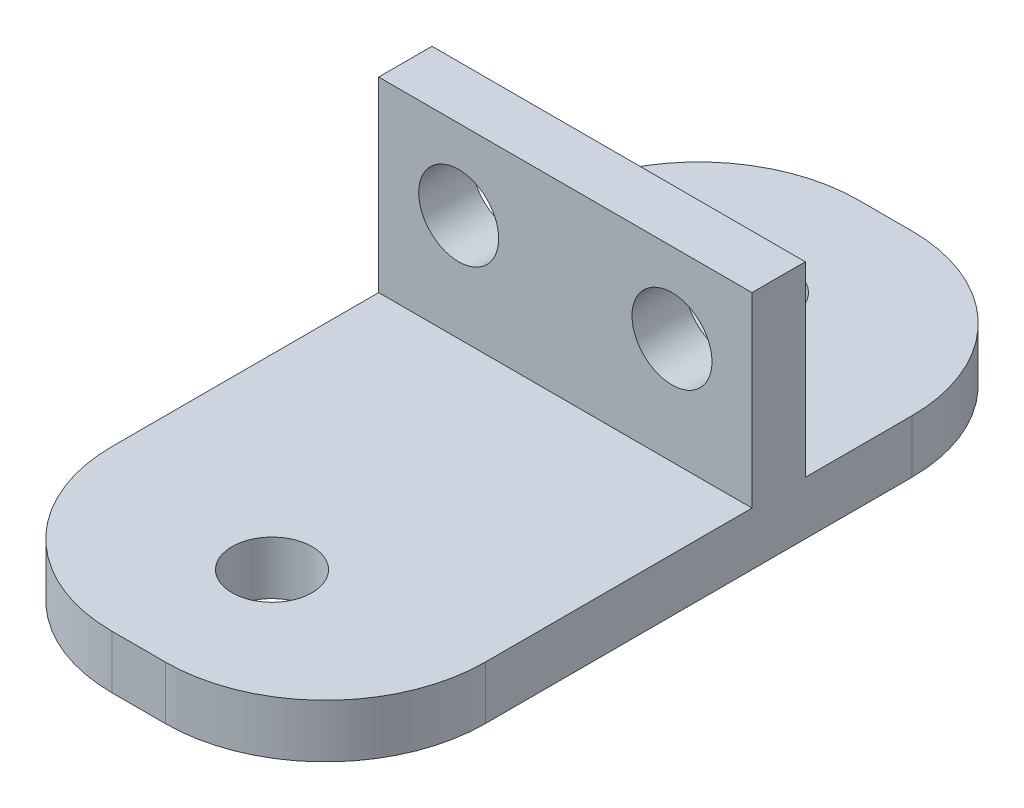
ISO-10303-21;
HEADER;
FILE_DESCRIPTION(('STEP AP214'),'2;1');
FILE_NAME('part.step','',(''),(''),'','','');
FILE_SCHEMA(('AUTOMOTIVE_DESIGN { 1 0 10303 214 1 1 1 1 }'));
ENDSEC;
DATA;
#1=APPLICATION_CONTEXT('core data for automotive mechanical design processes');
#2=APPLICATION_PROTOCOL_DEFINITION('international standard','automotive_design',2000,#1);
#3=PRODUCT_CONTEXT('',#1,'mechanical');
#4=PRODUCT('Part','Part','',(#3));
#5=PRODUCT_RELATED_PRODUCT_CATEGORY('part','',(#4));
#6=PRODUCT_DEFINITION_FORMATION('','',#4);
#7=PRODUCT_DEFINITION_CONTEXT('part definition',#1,'design');
#8=PRODUCT_DEFINITION('design','',#6,#7);
#9=PRODUCT_DEFINITION_SHAPE('','',#8);
#10=(LENGTH_UNIT() NAMED_UNIT(*) SI_UNIT(.MILLI.,.METRE.));
#11=(NAMED_UNIT(*) PLANE_ANGLE_UNIT() SI_UNIT($,.RADIAN.));
#12=(NAMED_UNIT(*) SI_UNIT($,.STERADIAN.) SOLID_ANGLE_UNIT());
#13=UNCERTAINTY_MEASURE_WITH_UNIT(LENGTH_MEASURE(1.E-05),#10,'distance_accuracy_value','');
#14=(GEOMETRIC_REPRESENTATION_CONTEXT(3) GLOBAL_UNCERTAINTY_ASSIGNED_CONTEXT((#13)) GLOBAL_UNIT_ASSIGNED_CONTEXT((#10,
#11,#12)) REPRESENTATION_CONTEXT('',''));
#15=CARTESIAN_POINT('',(0.,0.,0.));
#16=DIRECTION('',(0.,0.,1.));
#17=DIRECTION('',(1.,0.,0.));
#18=AXIS2_PLACEMENT_3D('',#15,#16,#17);
#19=CARTESIAN_POINT('',(0.,0.,0.));
#20=DIRECTION('',(0.,-1.,0.));
#21=DIRECTION('',(0.,0.,-1.));
#22=AXIS2_PLACEMENT_3D('',#19,#20,#21);
#23=PLANE('',#22);
#24=CARTESIAN_POINT('',(7.,0.,-23.));
#25=DIRECTION('',(0.,-1.,0.));
#26=DIRECTION('',(0.,0.,-1.));
#27=AXIS2_PLACEMENT_3D('',#24,#25,#26);
#28=CIRCLE('',#27,1.5);
#29=CARTESIAN_POINT('',(7.,0.,-24.5));
#30=VERTEX_POINT('',#29);
#31=EDGE_CURVE('E156',#30,#30,#28,.T.);
#32=ORIENTED_EDGE('',*,*,#31,.T.);
#33=EDGE_LOOP('',(#32));
#34=FACE_BOUND('',#33,.T.);
#35=DIRECTION('',(0.,0.,1.));
#36=VECTOR('',#35,1.);
#37=CARTESIAN_POINT('',(14.,0.,0.));
#38=LINE('',#37,#36);
#39=CARTESIAN_POINT('',(14.,0.,-22.));
#40=VERTEX_POINT('',#39);
#41=CARTESIAN_POINT('',(14.,0.,-18.));
#42=VERTEX_POINT('',#41);
#43=EDGE_CURVE('E189',#40,#42,#38,.T.);
#44=ORIENTED_EDGE('',*,*,#43,.F.);
#45=CARTESIAN_POINT('',(8.,0.,-22.));
#46=DIRECTION('',(0.,-1.,0.));
#47=DIRECTION('',(0.,0.,-1.));
#48=AXIS2_PLACEMENT_3D('',#45,#46,#47);
#49=CIRCLE('',#48,6.);
#50=CARTESIAN_POINT('',(8.,0.,-28.));
#51=VERTEX_POINT('',#50);
#52=EDGE_CURVE('E50',#40,#51,#49,.F.);
#53=ORIENTED_EDGE('',*,*,#52,.T.);
#54=DIRECTION('',(1.,0.,0.));
#55=VECTOR('',#54,1.);
#56=CARTESIAN_POINT('',(0.,0.,-28.));
#57=LINE('',#56,#55);
#58=CARTESIAN_POINT('',(6.,0.,-28.));
#59=VERTEX_POINT('',#58);
#60=EDGE_CURVE('E186',#59,#51,#57,.T.);
#61=ORIENTED_EDGE('',*,*,#60,.F.);
#62=CARTESIAN_POINT('',(6.,0.,-22.));
#63=DIRECTION('',(0.,-1.,0.));
#64=DIRECTION('',(0.,0.,-1.));
#65=AXIS2_PLACEMENT_3D('',#62,#63,#64);
#66=CIRCLE('',#65,6.);
#67=CARTESIAN_POINT('',(0.,0.,-22.));
#68=VERTEX_POINT('',#67);
#69=EDGE_CURVE('E58',#59,#68,#66,.F.);
#70=ORIENTED_EDGE('',*,*,#69,.T.);
#71=DIRECTION('',(0.,0.,-1.));
#72=VECTOR('',#71,1.);
#73=CARTESIAN_POINT('',(0.,0.,0.));
#74=LINE('',#73,#72);
#75=CARTESIAN_POINT('',(0.,0.,-18.));
#76=VERTEX_POINT('',#75);
#77=EDGE_CURVE('E168',#76,#68,#74,.T.);
#78=ORIENTED_EDGE('',*,*,#77,.F.);
#79=DIRECTION('',(-1.,0.,0.));
#80=VECTOR('',#79,1.);
#81=CARTESIAN_POINT('',(0.,0.,-18.));
#82=LINE('',#81,#80);
#83=EDGE_CURVE('E145',#42,#76,#82,.T.);
#84=ORIENTED_EDGE('',*,*,#83,.F.);
#85=EDGE_LOOP('',(#44,#53,#61,#70,#78,#84));
#86=FACE_BOUND('',#85,.T.);
#87=ADVANCED_FACE('F35',(#34,#86),#23,.F.);
#88=CARTESIAN_POINT('',(7.,0.,-5.));
#89=DIRECTION('',(0.,-1.,0.));
#90=DIRECTION('',(0.,0.,-1.));
#91=AXIS2_PLACEMENT_3D('',#88,#89,#90);
#92=CIRCLE('',#91,1.5);
#93=CARTESIAN_POINT('',(7.,0.,-6.5));
#94=VERTEX_POINT('',#93);
#95=EDGE_CURVE('E165',#94,#94,#92,.T.);
#96=ORIENTED_EDGE('',*,*,#95,.T.);
#97=EDGE_LOOP('',(#96));
#98=FACE_BOUND('',#97,.T.);
#99=CARTESIAN_POINT('',(0.,0.,-6.));
#100=VERTEX_POINT('',#99);
#101=CARTESIAN_POINT('',(0.,0.,-16.));
#102=VERTEX_POINT('',#101);
#103=EDGE_CURVE('E151',#100,#102,#74,.T.);
#104=ORIENTED_EDGE('',*,*,#103,.F.);
#105=CARTESIAN_POINT('',(6.,0.,-6.));
#106=DIRECTION('',(0.,-1.,0.));
#107=DIRECTION('',(0.,0.,-1.));
#108=AXIS2_PLACEMENT_3D('',#105,#106,#107);
#109=CIRCLE('',#108,6.);
#110=CARTESIAN_POINT('',(6.,0.,0.));
#111=VERTEX_POINT('',#110);
#112=EDGE_CURVE('E198',#100,#111,#109,.F.);
#113=ORIENTED_EDGE('',*,*,#112,.T.);
#114=DIRECTION('',(-1.,0.,0.));
#115=VECTOR('',#114,1.);
#116=CARTESIAN_POINT('',(0.,0.,0.));
#117=LINE('',#116,#115);
#118=CARTESIAN_POINT('',(8.,0.,0.));
#119=VERTEX_POINT('',#118);
#120=EDGE_CURVE('E175',#119,#111,#117,.T.);
#121=ORIENTED_EDGE('',*,*,#120,.F.);
#122=CARTESIAN_POINT('',(8.,0.,-6.));
#123=DIRECTION('',(0.,-1.,0.));
#124=DIRECTION('',(0.,0.,-1.));
#125=AXIS2_PLACEMENT_3D('',#122,#123,#124);
#126=CIRCLE('',#125,6.);
#127=CARTESIAN_POINT('',(14.,0.,-6.));
#128=VERTEX_POINT('',#127);
#129=EDGE_CURVE('E196',#119,#128,#126,.F.);
#130=ORIENTED_EDGE('',*,*,#129,.T.);
#131=CARTESIAN_POINT('',(14.,0.,-16.));
#132=VERTEX_POINT('',#131);
#133=EDGE_CURVE('E188',#132,#128,#38,.T.);
#134=ORIENTED_EDGE('',*,*,#133,.F.);
#135=DIRECTION('',(1.,0.,0.));
#136=VECTOR('',#135,1.);
#137=CARTESIAN_POINT('',(0.,0.,-16.));
#138=LINE('',#137,#136);
#139=EDGE_CURVE('E256',#102,#132,#138,.T.);
#140=ORIENTED_EDGE('',*,*,#139,.F.);
#141=EDGE_LOOP('',(#104,#113,#121,#130,#134,#140));
#142=FACE_BOUND('',#141,.T.);
#143=ADVANCED_FACE('F238',(#98,#142),#23,.F.);
#144=CARTESIAN_POINT('',(0.,-2.,0.));
#145=DIRECTION('',(1.,0.,0.));
#146=DIRECTION('',(0.,0.,-1.));
#147=AXIS2_PLACEMENT_3D('',#144,#145,#146);
#148=PLANE('',#147);
#149=DIRECTION('',(0.,0.,-1.));
#150=VECTOR('',#149,1.);
#151=CARTESIAN_POINT('',(0.,-2.,0.));
#152=LINE('',#151,#150);
#153=CARTESIAN_POINT('',(0.,-2.,-6.));
#154=VERTEX_POINT('',#153);
#155=CARTESIAN_POINT('',(0.,-2.,-22.));
#156=VERTEX_POINT('',#155);
#157=EDGE_CURVE('E171',#154,#156,#152,.T.);
#158=ORIENTED_EDGE('',*,*,#157,.F.);
#159=DIRECTION('',(0.,1.,0.));
#160=VECTOR('',#159,1.);
#161=CARTESIAN_POINT('',(0.,-2.,-6.));
#162=LINE('',#161,#160);
#163=EDGE_CURVE('E194',#154,#100,#162,.T.);
#164=ORIENTED_EDGE('',*,*,#163,.T.);
#165=ORIENTED_EDGE('',*,*,#103,.T.);
#166=DIRECTION('',(0.,-1.,0.));
#167=VECTOR('',#166,1.);
#168=CARTESIAN_POINT('',(0.,7.,-16.));
#169=LINE('',#168,#167);
#170=CARTESIAN_POINT('',(0.,7.,-16.));
#171=VERTEX_POINT('',#170);
#172=EDGE_CURVE('E130',#171,#102,#169,.T.);
#173=ORIENTED_EDGE('',*,*,#172,.F.);
#174=DIRECTION('',(0.,0.,1.));
#175=VECTOR('',#174,1.);
#176=CARTESIAN_POINT('',(0.,7.,-16.));
#177=LINE('',#176,#175);
#178=CARTESIAN_POINT('',(0.,7.,-18.));
#179=VERTEX_POINT('',#178);
#180=EDGE_CURVE('E136',#179,#171,#177,.T.);
#181=ORIENTED_EDGE('',*,*,#180,.F.);
#182=DIRECTION('',(0.,-1.,0.));
#183=VECTOR('',#182,1.);
#184=CARTESIAN_POINT('',(0.,7.,-18.));
#185=LINE('',#184,#183);
#186=EDGE_CURVE('E227',#179,#76,#185,.T.);
#187=ORIENTED_EDGE('',*,*,#186,.T.);
#188=ORIENTED_EDGE('',*,*,#77,.T.);
#189=DIRECTION('',(0.,1.,0.));
#190=VECTOR('',#189,1.);
#191=CARTESIAN_POINT('',(0.,-2.,-22.));
#192=LINE('',#191,#190);
#193=EDGE_CURVE('E184',#68,#156,#192,.F.);
#194=ORIENTED_EDGE('',*,*,#193,.T.);
#195=EDGE_LOOP('',(#158,#164,#165,#173,#181,#187,#188,#194));
#196=FACE_BOUND('',#195,.T.);
#197=ADVANCED_FACE('F148',(#196),#148,.F.);
#198=CARTESIAN_POINT('',(0.,-2.,-28.));
#199=DIRECTION('',(0.,0.,1.));
#200=DIRECTION('',(1.,0.,0.));
#201=AXIS2_PLACEMENT_3D('',#198,#199,#200);
#202=PLANE('',#201);
#203=ORIENTED_EDGE('',*,*,#60,.T.);
#204=DIRECTION('',(0.,1.,0.));
#205=VECTOR('',#204,1.);
#206=CARTESIAN_POINT('',(8.,-2.,-28.));
#207=LINE('',#206,#205);
#208=CARTESIAN_POINT('',(8.,-2.,-28.));
#209=VERTEX_POINT('',#208);
#210=EDGE_CURVE('E11',#51,#209,#207,.F.);
#211=ORIENTED_EDGE('',*,*,#210,.T.);
#212=DIRECTION('',(1.,0.,0.));
#213=VECTOR('',#212,1.);
#214=CARTESIAN_POINT('',(0.,-2.,-28.));
#215=LINE('',#214,#213);
#216=CARTESIAN_POINT('',(6.,-2.,-28.));
#217=VERTEX_POINT('',#216);
#218=EDGE_CURVE('E174',#217,#209,#215,.T.);
#219=ORIENTED_EDGE('',*,*,#218,.F.);
#220=DIRECTION('',(0.,1.,0.));
#221=VECTOR('',#220,1.);
#222=CARTESIAN_POINT('',(6.,-2.,-28.));
#223=LINE('',#222,#221);
#224=EDGE_CURVE('E43',#217,#59,#223,.T.);
#225=ORIENTED_EDGE('',*,*,#224,.T.);
#226=EDGE_LOOP('',(#203,#211,#219,#225));
#227=FACE_BOUND('',#226,.T.);
#228=ADVANCED_FACE('F221',(#227),#202,.F.);
#229=CARTESIAN_POINT('',(14.,-2.,0.));
#230=DIRECTION('',(-1.,0.,0.));
#231=DIRECTION('',(0.,0.,1.));
#232=AXIS2_PLACEMENT_3D('',#229,#230,#231);
#233=PLANE('',#232);
#234=ORIENTED_EDGE('',*,*,#133,.T.);
#235=DIRECTION('',(0.,1.,0.));
#236=VECTOR('',#235,1.);
#237=CARTESIAN_POINT('',(14.,-2.,-6.));
#238=LINE('',#237,#236);
#239=CARTESIAN_POINT('',(14.,-2.,-6.));
#240=VERTEX_POINT('',#239);
#241=EDGE_CURVE('E216',#128,#240,#238,.F.);
#242=ORIENTED_EDGE('',*,*,#241,.T.);
#243=DIRECTION('',(0.,0.,1.));
#244=VECTOR('',#243,1.);
#245=CARTESIAN_POINT('',(14.,-2.,0.));
#246=LINE('',#245,#244);
#247=CARTESIAN_POINT('',(14.,-2.,-22.));
#248=VERTEX_POINT('',#247);
#249=EDGE_CURVE('E178',#248,#240,#246,.T.);
#250=ORIENTED_EDGE('',*,*,#249,.F.);
#251=DIRECTION('',(0.,1.,0.));
#252=VECTOR('',#251,1.);
#253=CARTESIAN_POINT('',(14.,-2.,-22.));
#254=LINE('',#253,#252);
#255=EDGE_CURVE('E213',#248,#40,#254,.T.);
#256=ORIENTED_EDGE('',*,*,#255,.T.);
#257=ORIENTED_EDGE('',*,*,#43,.T.);
#258=DIRECTION('',(0.,-1.,0.));
#259=VECTOR('',#258,1.);
#260=CARTESIAN_POINT('',(14.,7.,-18.));
#261=LINE('',#260,#259);
#262=CARTESIAN_POINT('',(14.,7.,-18.));
#263=VERTEX_POINT('',#262);
#264=EDGE_CURVE('E158',#263,#42,#261,.T.);
#265=ORIENTED_EDGE('',*,*,#264,.F.);
#266=DIRECTION('',(0.,0.,-1.));
#267=VECTOR('',#266,1.);
#268=CARTESIAN_POINT('',(14.,7.,-16.));
#269=LINE('',#268,#267);
#270=CARTESIAN_POINT('',(14.,7.,-16.));
#271=VERTEX_POINT('',#270);
#272=EDGE_CURVE('E135',#271,#263,#269,.T.);
#273=ORIENTED_EDGE('',*,*,#272,.F.);
#274=DIRECTION('',(0.,-1.,0.));
#275=VECTOR('',#274,1.);
#276=CARTESIAN_POINT('',(14.,7.,-16.));
#277=LINE('',#276,#275);
#278=EDGE_CURVE('E132',#271,#132,#277,.T.);
#279=ORIENTED_EDGE('',*,*,#278,.T.);
#280=EDGE_LOOP('',(#234,#242,#250,#256,#257,#265,#273,#279));
#281=FACE_BOUND('',#280,.T.);
#282=ADVANCED_FACE('F249',(#281),#233,.F.);
#283=CARTESIAN_POINT('',(0.,-2.,0.));
#284=DIRECTION('',(0.,0.,-1.));
#285=DIRECTION('',(-1.,0.,0.));
#286=AXIS2_PLACEMENT_3D('',#283,#284,#285);
#287=PLANE('',#286);
#288=ORIENTED_EDGE('',*,*,#120,.T.);
#289=DIRECTION('',(0.,1.,0.));
#290=VECTOR('',#289,1.);
#291=CARTESIAN_POINT('',(6.,-2.,0.));
#292=LINE('',#291,#290);
#293=CARTESIAN_POINT('',(6.,-2.,0.));
#294=VERTEX_POINT('',#293);
#295=EDGE_CURVE('E203',#111,#294,#292,.F.);
#296=ORIENTED_EDGE('',*,*,#295,.T.);
#297=DIRECTION('',(-1.,0.,0.));
#298=VECTOR('',#297,1.);
#299=CARTESIAN_POINT('',(0.,-2.,0.));
#300=LINE('',#299,#298);
#301=CARTESIAN_POINT('',(8.,-2.,0.));
#302=VERTEX_POINT('',#301);
#303=EDGE_CURVE('E181',#302,#294,#300,.T.);
#304=ORIENTED_EDGE('',*,*,#303,.F.);
#305=DIRECTION('',(0.,1.,0.));
#306=VECTOR('',#305,1.);
#307=CARTESIAN_POINT('',(8.,-2.,0.));
#308=LINE('',#307,#306);
#309=EDGE_CURVE('E200',#302,#119,#308,.T.);
#310=ORIENTED_EDGE('',*,*,#309,.T.);
#311=EDGE_LOOP('',(#288,#296,#304,#310));
#312=FACE_BOUND('',#311,.T.);
#313=ADVANCED_FACE('F240',(#312),#287,.F.);
#314=CARTESIAN_POINT('',(0.,-2.,0.));
#315=DIRECTION('',(0.,-1.,0.));
#316=DIRECTION('',(0.,0.,-1.));
#317=AXIS2_PLACEMENT_3D('',#314,#315,#316);
#318=PLANE('',#317);
#319=CARTESIAN_POINT('',(7.,-2.,-23.));
#320=DIRECTION('',(0.,-1.,0.));
#321=DIRECTION('',(0.,0.,-1.));
#322=AXIS2_PLACEMENT_3D('',#319,#320,#321);
#323=CIRCLE('',#322,1.5);
#324=CARTESIAN_POINT('',(7.,-2.,-24.5));
#325=VERTEX_POINT('',#324);
#326=EDGE_CURVE('E153',#325,#325,#323,.T.);
#327=ORIENTED_EDGE('',*,*,#326,.F.);
#328=EDGE_LOOP('',(#327));
#329=FACE_BOUND('',#328,.T.);
#330=CARTESIAN_POINT('',(7.,-2.,-5.));
#331=DIRECTION('',(0.,-1.,0.));
#332=DIRECTION('',(0.,0.,-1.));
#333=AXIS2_PLACEMENT_3D('',#330,#331,#332);
#334=CIRCLE('',#333,1.5);
#335=CARTESIAN_POINT('',(7.,-2.,-6.5));
#336=VERTEX_POINT('',#335);
#337=EDGE_CURVE('E163',#336,#336,#334,.T.);
#338=ORIENTED_EDGE('',*,*,#337,.F.);
#339=EDGE_LOOP('',(#338));
#340=FACE_BOUND('',#339,.T.);
#341=ORIENTED_EDGE('',*,*,#303,.T.);
#342=CARTESIAN_POINT('',(6.,-2.,-6.));
#343=DIRECTION('',(0.,-1.,0.));
#344=DIRECTION('',(0.,0.,-1.));
#345=AXIS2_PLACEMENT_3D('',#342,#343,#344);
#346=CIRCLE('',#345,6.);
#347=EDGE_CURVE('E211',#294,#154,#346,.T.);
#348=ORIENTED_EDGE('',*,*,#347,.T.);
#349=ORIENTED_EDGE('',*,*,#157,.T.);
#350=CARTESIAN_POINT('',(6.,-2.,-22.));
#351=DIRECTION('',(0.,-1.,0.));
#352=DIRECTION('',(0.,0.,-1.));
#353=AXIS2_PLACEMENT_3D('',#350,#351,#352);
#354=CIRCLE('',#353,6.);
#355=EDGE_CURVE('E205',#156,#217,#354,.T.);
#356=ORIENTED_EDGE('',*,*,#355,.T.);
#357=ORIENTED_EDGE('',*,*,#218,.T.);
#358=CARTESIAN_POINT('',(8.,-2.,-22.));
#359=DIRECTION('',(0.,-1.,0.));
#360=DIRECTION('',(0.,0.,-1.));
#361=AXIS2_PLACEMENT_3D('',#358,#359,#360);
#362=CIRCLE('',#361,6.);
#363=EDGE_CURVE('E207',#209,#248,#362,.T.);
#364=ORIENTED_EDGE('',*,*,#363,.T.);
#365=ORIENTED_EDGE('',*,*,#249,.T.);
#366=CARTESIAN_POINT('',(8.,-2.,-6.));
#367=DIRECTION('',(0.,-1.,0.));
#368=DIRECTION('',(0.,0.,-1.));
#369=AXIS2_PLACEMENT_3D('',#366,#367,#368);
#370=CIRCLE('',#369,6.);
#371=EDGE_CURVE('E209',#240,#302,#370,.T.);
#372=ORIENTED_EDGE('',*,*,#371,.T.);
#373=EDGE_LOOP('',(#341,#348,#349,#356,#357,#364,#365,#372));
#374=FACE_BOUND('',#373,.T.);
#375=ADVANCED_FACE('F229',(#329,#340,#374),#318,.T.);
#376=CARTESIAN_POINT('',(7.,0.,-5.));
#377=DIRECTION('',(0.,-1.,0.));
#378=DIRECTION('',(0.,0.,-1.));
#379=AXIS2_PLACEMENT_3D('',#376,#377,#378);
#380=CYLINDRICAL_SURFACE('',#379,1.5);
#381=ORIENTED_EDGE('',*,*,#95,.F.);
#382=EDGE_LOOP('',(#381));
#383=FACE_BOUND('',#382,.T.);
#384=ORIENTED_EDGE('',*,*,#337,.T.);
#385=EDGE_LOOP('',(#384));
#386=FACE_BOUND('',#385,.T.);
#387=ADVANCED_FACE('F308',(#383,#386),#380,.F.);
#388=CARTESIAN_POINT('',(7.,0.,-23.));
#389=DIRECTION('',(0.,-1.,0.));
#390=DIRECTION('',(0.,0.,-1.));
#391=AXIS2_PLACEMENT_3D('',#388,#389,#390);
#392=CYLINDRICAL_SURFACE('',#391,1.5);
#393=ORIENTED_EDGE('',*,*,#31,.F.);
#394=EDGE_LOOP('',(#393));
#395=FACE_BOUND('',#394,.T.);
#396=ORIENTED_EDGE('',*,*,#326,.T.);
#397=EDGE_LOOP('',(#396));
#398=FACE_BOUND('',#397,.T.);
#399=ADVANCED_FACE('F305',(#395,#398),#392,.F.);
#400=CARTESIAN_POINT('',(0.,7.,-16.));
#401=DIRECTION('',(0.,0.,-1.));
#402=DIRECTION('',(-1.,0.,0.));
#403=AXIS2_PLACEMENT_3D('',#400,#401,#402);
#404=PLANE('',#403);
#405=CARTESIAN_POINT('',(3.,4.,-16.));
#406=DIRECTION('',(0.,0.,-1.));
#407=DIRECTION('',(-1.,0.,0.));
#408=AXIS2_PLACEMENT_3D('',#405,#406,#407);
#409=CIRCLE('',#408,1.5);
#410=CARTESIAN_POINT('',(1.5,4.,-16.));
#411=VERTEX_POINT('',#410);
#412=EDGE_CURVE('E419',#411,#411,#409,.T.);
#413=ORIENTED_EDGE('',*,*,#412,.T.);
#414=EDGE_LOOP('',(#413));
#415=FACE_BOUND('',#414,.T.);
#416=CARTESIAN_POINT('',(11.,4.,-16.));
#417=DIRECTION('',(0.,0.,-1.));
#418=DIRECTION('',(-1.,0.,0.));
#419=AXIS2_PLACEMENT_3D('',#416,#417,#418);
#420=CIRCLE('',#419,1.5);
#421=CARTESIAN_POINT('',(9.5,4.,-16.));
#422=VERTEX_POINT('',#421);
#423=EDGE_CURVE('E258',#422,#422,#420,.T.);
#424=ORIENTED_EDGE('',*,*,#423,.T.);
#425=EDGE_LOOP('',(#424));
#426=FACE_BOUND('',#425,.T.);
#427=ORIENTED_EDGE('',*,*,#139,.T.);
#428=ORIENTED_EDGE('',*,*,#278,.F.);
#429=DIRECTION('',(1.,0.,0.));
#430=VECTOR('',#429,1.);
#431=CARTESIAN_POINT('',(0.,7.,-16.));
#432=LINE('',#431,#430);
#433=EDGE_CURVE('E125',#171,#271,#432,.T.);
#434=ORIENTED_EDGE('',*,*,#433,.F.);
#435=ORIENTED_EDGE('',*,*,#172,.T.);
#436=EDGE_LOOP('',(#427,#428,#434,#435));
#437=FACE_BOUND('',#436,.T.);
#438=ADVANCED_FACE('F128',(#415,#426,#437),#404,.F.);
#439=CARTESIAN_POINT('',(0.,7.,-18.));
#440=DIRECTION('',(0.,0.,1.));
#441=DIRECTION('',(1.,0.,0.));
#442=AXIS2_PLACEMENT_3D('',#439,#440,#441);
#443=PLANE('',#442);
#444=CARTESIAN_POINT('',(3.,4.,-18.));
#445=DIRECTION('',(0.,0.,-1.));
#446=DIRECTION('',(-1.,0.,0.));
#447=AXIS2_PLACEMENT_3D('',#444,#445,#446);
#448=CIRCLE('',#447,1.5);
#449=CARTESIAN_POINT('',(1.5,4.,-18.));
#450=VERTEX_POINT('',#449);
#451=EDGE_CURVE('E416',#450,#450,#448,.T.);
#452=ORIENTED_EDGE('',*,*,#451,.F.);
#453=EDGE_LOOP('',(#452));
#454=FACE_BOUND('',#453,.T.);
#455=CARTESIAN_POINT('',(11.,4.,-18.));
#456=DIRECTION('',(0.,0.,-1.));
#457=DIRECTION('',(-1.,0.,0.));
#458=AXIS2_PLACEMENT_3D('',#455,#456,#457);
#459=CIRCLE('',#458,1.5);
#460=CARTESIAN_POINT('',(9.5,4.,-18.));
#461=VERTEX_POINT('',#460);
#462=EDGE_CURVE('E420',#461,#461,#459,.T.);
#463=ORIENTED_EDGE('',*,*,#462,.F.);
#464=EDGE_LOOP('',(#463));
#465=FACE_BOUND('',#464,.T.);
#466=ORIENTED_EDGE('',*,*,#83,.T.);
#467=ORIENTED_EDGE('',*,*,#186,.F.);
#468=DIRECTION('',(-1.,0.,0.));
#469=VECTOR('',#468,1.);
#470=CARTESIAN_POINT('',(0.,7.,-18.));
#471=LINE('',#470,#469);
#472=EDGE_CURVE('E141',#263,#179,#471,.T.);
#473=ORIENTED_EDGE('',*,*,#472,.F.);
#474=ORIENTED_EDGE('',*,*,#264,.T.);
#475=EDGE_LOOP('',(#466,#467,#473,#474));
#476=FACE_BOUND('',#475,.T.);
#477=ADVANCED_FACE('F261',(#454,#465,#476),#443,.F.);
#478=CARTESIAN_POINT('',(0.,7.,0.));
#479=DIRECTION('',(0.,-1.,0.));
#480=DIRECTION('',(0.,0.,-1.));
#481=AXIS2_PLACEMENT_3D('',#478,#479,#480);
#482=PLANE('',#481);
#483=ORIENTED_EDGE('',*,*,#180,.T.);
#484=ORIENTED_EDGE('',*,*,#433,.T.);
#485=ORIENTED_EDGE('',*,*,#272,.T.);
#486=ORIENTED_EDGE('',*,*,#472,.T.);
#487=EDGE_LOOP('',(#483,#484,#485,#486));
#488=FACE_BOUND('',#487,.T.);
#489=ADVANCED_FACE('F139',(#488),#482,.F.);
#490=CARTESIAN_POINT('',(6.,-2.,-6.));
#491=DIRECTION('',(0.,1.,0.));
#492=DIRECTION('',(0.,0.,1.));
#493=AXIS2_PLACEMENT_3D('',#490,#491,#492);
#494=CYLINDRICAL_SURFACE('',#493,6.);
#495=ORIENTED_EDGE('',*,*,#347,.F.);
#496=ORIENTED_EDGE('',*,*,#295,.F.);
#497=ORIENTED_EDGE('',*,*,#112,.F.);
#498=ORIENTED_EDGE('',*,*,#163,.F.);
#499=EDGE_LOOP('',(#495,#496,#497,#498));
#500=FACE_BOUND('',#499,.T.);
#501=ADVANCED_FACE('F234',(#500),#494,.T.);
#502=CARTESIAN_POINT('',(8.,-2.,-6.));
#503=DIRECTION('',(0.,1.,0.));
#504=DIRECTION('',(0.,0.,1.));
#505=AXIS2_PLACEMENT_3D('',#502,#503,#504);
#506=CYLINDRICAL_SURFACE('',#505,6.);
#507=ORIENTED_EDGE('',*,*,#371,.F.);
#508=ORIENTED_EDGE('',*,*,#241,.F.);
#509=ORIENTED_EDGE('',*,*,#129,.F.);
#510=ORIENTED_EDGE('',*,*,#309,.F.);
#511=EDGE_LOOP('',(#507,#508,#509,#510));
#512=FACE_BOUND('',#511,.T.);
#513=ADVANCED_FACE('F245',(#512),#506,.T.);
#514=CARTESIAN_POINT('',(8.,-2.,-22.));
#515=DIRECTION('',(0.,1.,0.));
#516=DIRECTION('',(0.,0.,1.));
#517=AXIS2_PLACEMENT_3D('',#514,#515,#516);
#518=CYLINDRICAL_SURFACE('',#517,6.);
#519=ORIENTED_EDGE('',*,*,#363,.F.);
#520=ORIENTED_EDGE('',*,*,#210,.F.);
#521=ORIENTED_EDGE('',*,*,#52,.F.);
#522=ORIENTED_EDGE('',*,*,#255,.F.);
#523=EDGE_LOOP('',(#519,#520,#521,#522));
#524=FACE_BOUND('',#523,.T.);
#525=ADVANCED_FACE('F264',(#524),#518,.T.);
#526=CARTESIAN_POINT('',(6.,-2.,-22.));
#527=DIRECTION('',(0.,1.,0.));
#528=DIRECTION('',(0.,0.,1.));
#529=AXIS2_PLACEMENT_3D('',#526,#527,#528);
#530=CYLINDRICAL_SURFACE('',#529,6.);
#531=ORIENTED_EDGE('',*,*,#355,.F.);
#532=ORIENTED_EDGE('',*,*,#193,.F.);
#533=ORIENTED_EDGE('',*,*,#69,.F.);
#534=ORIENTED_EDGE('',*,*,#224,.F.);
#535=EDGE_LOOP('',(#531,#532,#533,#534));
#536=FACE_BOUND('',#535,.T.);
#537=ADVANCED_FACE('F37',(#536),#530,.T.);
#538=CARTESIAN_POINT('',(11.,4.,-3.));
#539=DIRECTION('',(0.,0.,-1.));
#540=DIRECTION('',(-1.,0.,0.));
#541=AXIS2_PLACEMENT_3D('',#538,#539,#540);
#542=CYLINDRICAL_SURFACE('',#541,1.5);
#543=ORIENTED_EDGE('',*,*,#462,.T.);
#544=EDGE_LOOP('',(#543));
#545=FACE_BOUND('',#544,.T.);
#546=ORIENTED_EDGE('',*,*,#423,.F.);
#547=EDGE_LOOP('',(#546));
#548=FACE_BOUND('',#547,.T.);
#549=ADVANCED_FACE('F270',(#545,#548),#542,.F.);
#550=CARTESIAN_POINT('',(3.,4.,-3.));
#551=DIRECTION('',(0.,0.,-1.));
#552=DIRECTION('',(-1.,0.,0.));
#553=AXIS2_PLACEMENT_3D('',#550,#551,#552);
#554=CYLINDRICAL_SURFACE('',#553,1.5);
#555=ORIENTED_EDGE('',*,*,#451,.T.);
#556=EDGE_LOOP('',(#555));
#557=FACE_BOUND('',#556,.T.);
#558=ORIENTED_EDGE('',*,*,#412,.F.);
#559=EDGE_LOOP('',(#558));
#560=FACE_BOUND('',#559,.T.);
#561=ADVANCED_FACE('F400',(#557,#560),#554,.F.);
#562=CLOSED_SHELL('',(#87,#143,#197,#228,#282,#313,#375,#387,#399,#438,#477,#489,#501,#513,#525,
#537,#549,#561));
#563=MANIFOLD_SOLID_BREP('B2',#562);
#564=ADVANCED_BREP_SHAPE_REPRESENTATION('',(#18,#563),#14);
#565=SHAPE_DEFINITION_REPRESENTATION(#9,#564);
ENDSEC;
END-ISO-10303-21;
